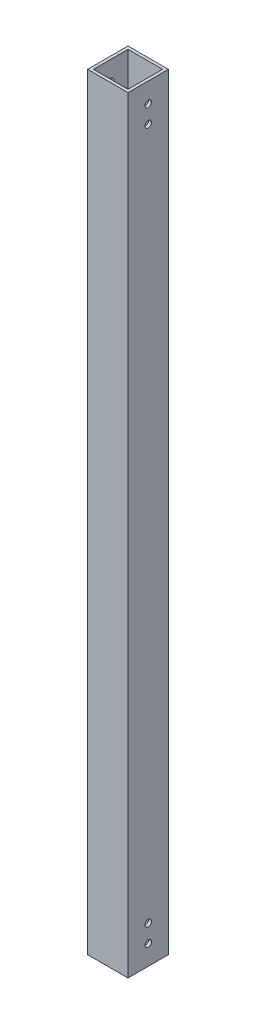
ISO-10303-21;
HEADER;
FILE_DESCRIPTION(('STEP AP214'),'2;1');
FILE_NAME('part.step','',(''),(''),'','','');
FILE_SCHEMA(('AUTOMOTIVE_DESIGN { 1 0 10303 214 1 1 1 1 }'));
ENDSEC;
DATA;
#1=APPLICATION_CONTEXT('core data for automotive mechanical design processes');
#2=APPLICATION_PROTOCOL_DEFINITION('international standard','automotive_design',2000,#1);
#3=PRODUCT_CONTEXT('',#1,'mechanical');
#4=PRODUCT('Part','Part','',(#3));
#5=PRODUCT_RELATED_PRODUCT_CATEGORY('part','',(#4));
#6=PRODUCT_DEFINITION_FORMATION('','',#4);
#7=PRODUCT_DEFINITION_CONTEXT('part definition',#1,'design');
#8=PRODUCT_DEFINITION('design','',#6,#7);
#9=PRODUCT_DEFINITION_SHAPE('','',#8);
#10=(LENGTH_UNIT() NAMED_UNIT(*) SI_UNIT(.MILLI.,.METRE.));
#11=(NAMED_UNIT(*) PLANE_ANGLE_UNIT() SI_UNIT($,.RADIAN.));
#12=(NAMED_UNIT(*) SI_UNIT($,.STERADIAN.) SOLID_ANGLE_UNIT());
#13=UNCERTAINTY_MEASURE_WITH_UNIT(LENGTH_MEASURE(1.E-05),#10,'distance_accuracy_value','');
#14=(GEOMETRIC_REPRESENTATION_CONTEXT(3) GLOBAL_UNCERTAINTY_ASSIGNED_CONTEXT((#13)) GLOBAL_UNIT_ASSIGNED_CONTEXT((#10,
#11,#12)) REPRESENTATION_CONTEXT('',''));
#15=CARTESIAN_POINT('',(0.,0.,0.));
#16=DIRECTION('',(0.,0.,1.));
#17=DIRECTION('',(1.,0.,0.));
#18=AXIS2_PLACEMENT_3D('',#15,#16,#17);
#19=CARTESIAN_POINT('',(-22.225,844.55,22.225));
#20=DIRECTION('',(1.,0.,0.));
#21=DIRECTION('',(0.,0.,-1.));
#22=AXIS2_PLACEMENT_3D('',#19,#20,#21);
#23=PLANE('',#22);
#24=CARTESIAN_POINT('',(-22.225,803.275,0.));
#25=DIRECTION('',(-1.,0.,0.));
#26=DIRECTION('',(0.,0.,1.));
#27=AXIS2_PLACEMENT_3D('',#24,#25,#26);
#28=CIRCLE('',#27,3.57123999999998);
#29=CARTESIAN_POINT('',(-22.225,803.275,3.57123999999997));
#30=VERTEX_POINT('',#29);
#31=EDGE_CURVE('E207',#30,#30,#28,.T.);
#32=ORIENTED_EDGE('',*,*,#31,.F.);
#33=EDGE_LOOP('',(#32));
#34=FACE_BOUND('',#33,.T.);
#35=CARTESIAN_POINT('',(-22.225,41.2749999999999,0.));
#36=DIRECTION('',(-1.,0.,0.));
#37=DIRECTION('',(0.,0.,1.));
#38=AXIS2_PLACEMENT_3D('',#35,#36,#37);
#39=CIRCLE('',#38,3.57123999999999);
#40=CARTESIAN_POINT('',(-22.225,41.2749999999999,3.57123999999999));
#41=VERTEX_POINT('',#40);
#42=EDGE_CURVE('E195',#41,#41,#39,.T.);
#43=ORIENTED_EDGE('',*,*,#42,.F.);
#44=EDGE_LOOP('',(#43));
#45=FACE_BOUND('',#44,.T.);
#46=CARTESIAN_POINT('',(-22.225,822.721875,0.));
#47=DIRECTION('',(-1.,0.,0.));
#48=DIRECTION('',(0.,0.,1.));
#49=AXIS2_PLACEMENT_3D('',#46,#47,#48);
#50=CIRCLE('',#49,3.57123999999998);
#51=CARTESIAN_POINT('',(-22.225,822.721875,3.57123999999998));
#52=VERTEX_POINT('',#51);
#53=EDGE_CURVE('E186',#52,#52,#50,.T.);
#54=ORIENTED_EDGE('',*,*,#53,.F.);
#55=EDGE_LOOP('',(#54));
#56=FACE_BOUND('',#55,.T.);
#57=DIRECTION('',(0.,0.,1.));
#58=VECTOR('',#57,1.);
#59=CARTESIAN_POINT('',(-22.225,0.,22.225));
#60=LINE('',#59,#58);
#61=CARTESIAN_POINT('',(-22.225,0.,-22.225));
#62=VERTEX_POINT('',#61);
#63=CARTESIAN_POINT('',(-22.225,0.,22.225));
#64=VERTEX_POINT('',#63);
#65=EDGE_CURVE('E154',#62,#64,#60,.T.);
#66=ORIENTED_EDGE('',*,*,#65,.T.);
#67=DIRECTION('',(0.,-1.,0.));
#68=VECTOR('',#67,1.);
#69=CARTESIAN_POINT('',(-22.225,844.55,22.225));
#70=LINE('',#69,#68);
#71=CARTESIAN_POINT('',(-22.225,844.55,22.225));
#72=VERTEX_POINT('',#71);
#73=EDGE_CURVE('E159',#72,#64,#70,.T.);
#74=ORIENTED_EDGE('',*,*,#73,.F.);
#75=DIRECTION('',(0.,0.,1.));
#76=VECTOR('',#75,1.);
#77=CARTESIAN_POINT('',(-22.225,844.55,22.225));
#78=LINE('',#77,#76);
#79=CARTESIAN_POINT('',(-22.225,844.55,-22.225));
#80=VERTEX_POINT('',#79);
#81=EDGE_CURVE('E145',#80,#72,#78,.T.);
#82=ORIENTED_EDGE('',*,*,#81,.F.);
#83=DIRECTION('',(0.,-1.,0.));
#84=VECTOR('',#83,1.);
#85=CARTESIAN_POINT('',(-22.225,844.55,-22.225));
#86=LINE('',#85,#84);
#87=EDGE_CURVE('E42',#80,#62,#86,.T.);
#88=ORIENTED_EDGE('',*,*,#87,.T.);
#89=EDGE_LOOP('',(#66,#74,#82,#88));
#90=FACE_BOUND('',#89,.T.);
#91=CARTESIAN_POINT('',(-22.225,21.828125,0.));
#92=DIRECTION('',(-1.,0.,0.));
#93=DIRECTION('',(0.,0.,1.));
#94=AXIS2_PLACEMENT_3D('',#91,#92,#93);
#95=CIRCLE('',#94,3.57123999999999);
#96=CARTESIAN_POINT('',(-22.225,21.828125,3.57123999999999));
#97=VERTEX_POINT('',#96);
#98=EDGE_CURVE('E170',#97,#97,#95,.T.);
#99=ORIENTED_EDGE('',*,*,#98,.F.);
#100=EDGE_LOOP('',(#99));
#101=FACE_BOUND('',#100,.T.);
#102=ADVANCED_FACE('F33',(#34,#45,#56,#90,#101),#23,.F.);
#103=CARTESIAN_POINT('',(0.,844.55,0.));
#104=DIRECTION('',(0.,-1.,0.));
#105=DIRECTION('',(0.,0.,-1.));
#106=AXIS2_PLACEMENT_3D('',#103,#104,#105);
#107=PLANE('',#106);
#108=DIRECTION('',(0.,0.,-1.));
#109=VECTOR('',#108,1.);
#110=CARTESIAN_POINT('',(22.225,844.55,22.225));
#111=LINE('',#110,#109);
#112=CARTESIAN_POINT('',(22.225,844.55,22.225));
#113=VERTEX_POINT('',#112);
#114=CARTESIAN_POINT('',(22.225,844.55,-22.225));
#115=VERTEX_POINT('',#114);
#116=EDGE_CURVE('E139',#113,#115,#111,.T.);
#117=ORIENTED_EDGE('',*,*,#116,.T.);
#118=DIRECTION('',(-1.,0.,0.));
#119=VECTOR('',#118,1.);
#120=CARTESIAN_POINT('',(-22.225,844.55,-22.225));
#121=LINE('',#120,#119);
#122=EDGE_CURVE('E142',#115,#80,#121,.T.);
#123=ORIENTED_EDGE('',*,*,#122,.T.);
#124=ORIENTED_EDGE('',*,*,#81,.T.);
#125=DIRECTION('',(1.,0.,0.));
#126=VECTOR('',#125,1.);
#127=CARTESIAN_POINT('',(-22.225,844.55,22.225));
#128=LINE('',#127,#126);
#129=EDGE_CURVE('E147',#72,#113,#128,.T.);
#130=ORIENTED_EDGE('',*,*,#129,.T.);
#131=EDGE_LOOP('',(#117,#123,#124,#130));
#132=FACE_BOUND('',#131,.T.);
#133=DIRECTION('',(1.,0.,0.));
#134=VECTOR('',#133,1.);
#135=CARTESIAN_POINT('',(-19.05,844.55,19.05));
#136=LINE('',#135,#134);
#137=CARTESIAN_POINT('',(-19.05,844.55,19.05));
#138=VERTEX_POINT('',#137);
#139=CARTESIAN_POINT('',(19.05,844.55,19.05));
#140=VERTEX_POINT('',#139);
#141=EDGE_CURVE('E100',#138,#140,#136,.T.);
#142=ORIENTED_EDGE('',*,*,#141,.F.);
#143=DIRECTION('',(0.,0.,1.));
#144=VECTOR('',#143,1.);
#145=CARTESIAN_POINT('',(-19.05,844.55,19.05));
#146=LINE('',#145,#144);
#147=CARTESIAN_POINT('',(-19.05,844.55,-19.05));
#148=VERTEX_POINT('',#147);
#149=EDGE_CURVE('E123',#148,#138,#146,.T.);
#150=ORIENTED_EDGE('',*,*,#149,.F.);
#151=DIRECTION('',(-1.,0.,0.));
#152=VECTOR('',#151,1.);
#153=CARTESIAN_POINT('',(-19.05,844.55,-19.05));
#154=LINE('',#153,#152);
#155=CARTESIAN_POINT('',(19.05,844.55,-19.05));
#156=VERTEX_POINT('',#155);
#157=EDGE_CURVE('E121',#156,#148,#154,.T.);
#158=ORIENTED_EDGE('',*,*,#157,.F.);
#159=DIRECTION('',(0.,0.,-1.));
#160=VECTOR('',#159,1.);
#161=CARTESIAN_POINT('',(19.05,844.55,19.05));
#162=LINE('',#161,#160);
#163=EDGE_CURVE('E108',#140,#156,#162,.T.);
#164=ORIENTED_EDGE('',*,*,#163,.F.);
#165=EDGE_LOOP('',(#142,#150,#158,#164));
#166=FACE_BOUND('',#165,.T.);
#167=ADVANCED_FACE('F120',(#132,#166),#107,.F.);
#168=CARTESIAN_POINT('',(0.,0.,0.));
#169=DIRECTION('',(0.,-1.,0.));
#170=DIRECTION('',(0.,0.,-1.));
#171=AXIS2_PLACEMENT_3D('',#168,#169,#170);
#172=PLANE('',#171);
#173=DIRECTION('',(0.,0.,-1.));
#174=VECTOR('',#173,1.);
#175=CARTESIAN_POINT('',(22.225,0.,22.225));
#176=LINE('',#175,#174);
#177=CARTESIAN_POINT('',(22.225,0.,22.225));
#178=VERTEX_POINT('',#177);
#179=CARTESIAN_POINT('',(22.225,0.,-22.225));
#180=VERTEX_POINT('',#179);
#181=EDGE_CURVE('E116',#178,#180,#176,.T.);
#182=ORIENTED_EDGE('',*,*,#181,.F.);
#183=DIRECTION('',(1.,0.,0.));
#184=VECTOR('',#183,1.);
#185=CARTESIAN_POINT('',(-22.225,0.,22.225));
#186=LINE('',#185,#184);
#187=EDGE_CURVE('E143',#64,#178,#186,.T.);
#188=ORIENTED_EDGE('',*,*,#187,.F.);
#189=ORIENTED_EDGE('',*,*,#65,.F.);
#190=DIRECTION('',(-1.,0.,0.));
#191=VECTOR('',#190,1.);
#192=CARTESIAN_POINT('',(-22.225,0.,-22.225));
#193=LINE('',#192,#191);
#194=EDGE_CURVE('E152',#180,#62,#193,.T.);
#195=ORIENTED_EDGE('',*,*,#194,.F.);
#196=EDGE_LOOP('',(#182,#188,#189,#195));
#197=FACE_BOUND('',#196,.T.);
#198=DIRECTION('',(0.,0.,1.));
#199=VECTOR('',#198,1.);
#200=CARTESIAN_POINT('',(-19.05,0.,19.05));
#201=LINE('',#200,#199);
#202=CARTESIAN_POINT('',(-19.05,0.,-19.05));
#203=VERTEX_POINT('',#202);
#204=CARTESIAN_POINT('',(-19.05,0.,19.05));
#205=VERTEX_POINT('',#204);
#206=EDGE_CURVE('E109',#203,#205,#201,.T.);
#207=ORIENTED_EDGE('',*,*,#206,.T.);
#208=DIRECTION('',(1.,0.,0.));
#209=VECTOR('',#208,1.);
#210=CARTESIAN_POINT('',(-19.05,0.,19.05));
#211=LINE('',#210,#209);
#212=CARTESIAN_POINT('',(19.05,0.,19.05));
#213=VERTEX_POINT('',#212);
#214=EDGE_CURVE('E58',#205,#213,#211,.T.);
#215=ORIENTED_EDGE('',*,*,#214,.T.);
#216=DIRECTION('',(0.,0.,-1.));
#217=VECTOR('',#216,1.);
#218=CARTESIAN_POINT('',(19.05,0.,19.05));
#219=LINE('',#218,#217);
#220=CARTESIAN_POINT('',(19.05,0.,-19.05));
#221=VERTEX_POINT('',#220);
#222=EDGE_CURVE('E115',#213,#221,#219,.T.);
#223=ORIENTED_EDGE('',*,*,#222,.T.);
#224=DIRECTION('',(-1.,0.,0.));
#225=VECTOR('',#224,1.);
#226=CARTESIAN_POINT('',(-19.05,0.,-19.05));
#227=LINE('',#226,#225);
#228=EDGE_CURVE('E131',#221,#203,#227,.T.);
#229=ORIENTED_EDGE('',*,*,#228,.T.);
#230=EDGE_LOOP('',(#207,#215,#223,#229));
#231=FACE_BOUND('',#230,.T.);
#232=ADVANCED_FACE('F256',(#197,#231),#172,.T.);
#233=CARTESIAN_POINT('',(22.225,844.55,22.225));
#234=DIRECTION('',(-1.,0.,0.));
#235=DIRECTION('',(0.,0.,1.));
#236=AXIS2_PLACEMENT_3D('',#233,#234,#235);
#237=PLANE('',#236);
#238=CARTESIAN_POINT('',(22.225,803.275,0.));
#239=DIRECTION('',(-1.,0.,0.));
#240=DIRECTION('',(0.,0.,1.));
#241=AXIS2_PLACEMENT_3D('',#238,#239,#240);
#242=CIRCLE('',#241,3.57123999999998);
#243=CARTESIAN_POINT('',(22.225,803.275,3.57123999999997));
#244=VERTEX_POINT('',#243);
#245=EDGE_CURVE('E204',#244,#244,#242,.T.);
#246=ORIENTED_EDGE('',*,*,#245,.T.);
#247=EDGE_LOOP('',(#246));
#248=FACE_BOUND('',#247,.T.);
#249=CARTESIAN_POINT('',(22.225,41.2749999999999,0.));
#250=DIRECTION('',(-1.,0.,0.));
#251=DIRECTION('',(0.,0.,1.));
#252=AXIS2_PLACEMENT_3D('',#249,#250,#251);
#253=CIRCLE('',#252,3.57123999999999);
#254=CARTESIAN_POINT('',(22.225,41.2749999999999,3.57123999999999));
#255=VERTEX_POINT('',#254);
#256=EDGE_CURVE('E192',#255,#255,#253,.T.);
#257=ORIENTED_EDGE('',*,*,#256,.T.);
#258=EDGE_LOOP('',(#257));
#259=FACE_BOUND('',#258,.T.);
#260=CARTESIAN_POINT('',(22.225,822.721875,0.));
#261=DIRECTION('',(-1.,0.,0.));
#262=DIRECTION('',(0.,0.,1.));
#263=AXIS2_PLACEMENT_3D('',#260,#261,#262);
#264=CIRCLE('',#263,3.57123999999998);
#265=CARTESIAN_POINT('',(22.225,822.721875,3.57123999999998));
#266=VERTEX_POINT('',#265);
#267=EDGE_CURVE('E183',#266,#266,#264,.T.);
#268=ORIENTED_EDGE('',*,*,#267,.T.);
#269=EDGE_LOOP('',(#268));
#270=FACE_BOUND('',#269,.T.);
#271=CARTESIAN_POINT('',(22.225,21.828125,0.));
#272=DIRECTION('',(-1.,0.,0.));
#273=DIRECTION('',(0.,0.,1.));
#274=AXIS2_PLACEMENT_3D('',#271,#272,#273);
#275=CIRCLE('',#274,3.57123999999999);
#276=CARTESIAN_POINT('',(22.225,21.828125,3.57123999999999));
#277=VERTEX_POINT('',#276);
#278=EDGE_CURVE('E165',#277,#277,#275,.T.);
#279=ORIENTED_EDGE('',*,*,#278,.T.);
#280=EDGE_LOOP('',(#279));
#281=FACE_BOUND('',#280,.T.);
#282=ORIENTED_EDGE('',*,*,#181,.T.);
#283=DIRECTION('',(0.,-1.,0.));
#284=VECTOR('',#283,1.);
#285=CARTESIAN_POINT('',(22.225,844.55,-22.225));
#286=LINE('',#285,#284);
#287=EDGE_CURVE('E11',#115,#180,#286,.T.);
#288=ORIENTED_EDGE('',*,*,#287,.F.);
#289=ORIENTED_EDGE('',*,*,#116,.F.);
#290=DIRECTION('',(0.,-1.,0.));
#291=VECTOR('',#290,1.);
#292=CARTESIAN_POINT('',(22.225,844.55,22.225));
#293=LINE('',#292,#291);
#294=EDGE_CURVE('E149',#113,#178,#293,.T.);
#295=ORIENTED_EDGE('',*,*,#294,.T.);
#296=EDGE_LOOP('',(#282,#288,#289,#295));
#297=FACE_BOUND('',#296,.T.);
#298=ADVANCED_FACE('F35',(#248,#259,#270,#281,#297),#237,.F.);
#299=CARTESIAN_POINT('',(-22.225,844.55,-22.225));
#300=DIRECTION('',(0.,0.,1.));
#301=DIRECTION('',(1.,0.,0.));
#302=AXIS2_PLACEMENT_3D('',#299,#300,#301);
#303=PLANE('',#302);
#304=ORIENTED_EDGE('',*,*,#194,.T.);
#305=ORIENTED_EDGE('',*,*,#87,.F.);
#306=ORIENTED_EDGE('',*,*,#122,.F.);
#307=ORIENTED_EDGE('',*,*,#287,.T.);
#308=EDGE_LOOP('',(#304,#305,#306,#307));
#309=FACE_BOUND('',#308,.T.);
#310=ADVANCED_FACE('F262',(#309),#303,.F.);
#311=CARTESIAN_POINT('',(-22.225,844.55,22.225));
#312=DIRECTION('',(0.,0.,-1.));
#313=DIRECTION('',(-1.,0.,0.));
#314=AXIS2_PLACEMENT_3D('',#311,#312,#313);
#315=PLANE('',#314);
#316=ORIENTED_EDGE('',*,*,#187,.T.);
#317=ORIENTED_EDGE('',*,*,#294,.F.);
#318=ORIENTED_EDGE('',*,*,#129,.F.);
#319=ORIENTED_EDGE('',*,*,#73,.T.);
#320=EDGE_LOOP('',(#316,#317,#318,#319));
#321=FACE_BOUND('',#320,.T.);
#322=ADVANCED_FACE('F253',(#321),#315,.F.);
#323=CARTESIAN_POINT('',(-19.05,844.55,19.05));
#324=DIRECTION('',(0.,0.,-1.));
#325=DIRECTION('',(-1.,0.,0.));
#326=AXIS2_PLACEMENT_3D('',#323,#324,#325);
#327=PLANE('',#326);
#328=ORIENTED_EDGE('',*,*,#214,.F.);
#329=DIRECTION('',(0.,-1.,0.));
#330=VECTOR('',#329,1.);
#331=CARTESIAN_POINT('',(-19.05,844.55,19.05));
#332=LINE('',#331,#330);
#333=EDGE_CURVE('E104',#138,#205,#332,.T.);
#334=ORIENTED_EDGE('',*,*,#333,.F.);
#335=ORIENTED_EDGE('',*,*,#141,.T.);
#336=DIRECTION('',(0.,-1.,0.));
#337=VECTOR('',#336,1.);
#338=CARTESIAN_POINT('',(19.05,844.55,19.05));
#339=LINE('',#338,#337);
#340=EDGE_CURVE('E103',#140,#213,#339,.T.);
#341=ORIENTED_EDGE('',*,*,#340,.T.);
#342=EDGE_LOOP('',(#328,#334,#335,#341));
#343=FACE_BOUND('',#342,.T.);
#344=ADVANCED_FACE('F102',(#343),#327,.T.);
#345=CARTESIAN_POINT('',(19.05,844.55,19.05));
#346=DIRECTION('',(-1.,0.,0.));
#347=DIRECTION('',(0.,0.,1.));
#348=AXIS2_PLACEMENT_3D('',#345,#346,#347);
#349=PLANE('',#348);
#350=CARTESIAN_POINT('',(19.05,803.275,0.));
#351=DIRECTION('',(-1.,0.,0.));
#352=DIRECTION('',(0.,0.,1.));
#353=AXIS2_PLACEMENT_3D('',#350,#351,#352);
#354=CIRCLE('',#353,3.57123999999998);
#355=CARTESIAN_POINT('',(19.05,803.275,3.57123999999997));
#356=VERTEX_POINT('',#355);
#357=EDGE_CURVE('E198',#356,#356,#354,.T.);
#358=ORIENTED_EDGE('',*,*,#357,.F.);
#359=EDGE_LOOP('',(#358));
#360=FACE_BOUND('',#359,.T.);
#361=CARTESIAN_POINT('',(19.05,41.2749999999999,0.));
#362=DIRECTION('',(-1.,0.,0.));
#363=DIRECTION('',(0.,0.,1.));
#364=AXIS2_PLACEMENT_3D('',#361,#362,#363);
#365=CIRCLE('',#364,3.57123999999999);
#366=CARTESIAN_POINT('',(19.05,41.2749999999999,3.57123999999999));
#367=VERTEX_POINT('',#366);
#368=EDGE_CURVE('E189',#367,#367,#365,.T.);
#369=ORIENTED_EDGE('',*,*,#368,.F.);
#370=EDGE_LOOP('',(#369));
#371=FACE_BOUND('',#370,.T.);
#372=CARTESIAN_POINT('',(19.05,822.721875,0.));
#373=DIRECTION('',(-1.,0.,0.));
#374=DIRECTION('',(0.,0.,1.));
#375=AXIS2_PLACEMENT_3D('',#372,#373,#374);
#376=CIRCLE('',#375,3.57123999999998);
#377=CARTESIAN_POINT('',(19.05,822.721875,3.57123999999998));
#378=VERTEX_POINT('',#377);
#379=EDGE_CURVE('E175',#378,#378,#376,.T.);
#380=ORIENTED_EDGE('',*,*,#379,.F.);
#381=EDGE_LOOP('',(#380));
#382=FACE_BOUND('',#381,.T.);
#383=CARTESIAN_POINT('',(19.05,21.828125,0.));
#384=DIRECTION('',(-1.,0.,0.));
#385=DIRECTION('',(0.,0.,1.));
#386=AXIS2_PLACEMENT_3D('',#383,#384,#385);
#387=CIRCLE('',#386,3.57123999999999);
#388=CARTESIAN_POINT('',(19.05,21.828125,3.57123999999999));
#389=VERTEX_POINT('',#388);
#390=EDGE_CURVE('E163',#389,#389,#387,.T.);
#391=ORIENTED_EDGE('',*,*,#390,.F.);
#392=EDGE_LOOP('',(#391));
#393=FACE_BOUND('',#392,.T.);
#394=ORIENTED_EDGE('',*,*,#222,.F.);
#395=ORIENTED_EDGE('',*,*,#340,.F.);
#396=ORIENTED_EDGE('',*,*,#163,.T.);
#397=DIRECTION('',(0.,-1.,0.));
#398=VECTOR('',#397,1.);
#399=CARTESIAN_POINT('',(19.05,844.55,-19.05));
#400=LINE('',#399,#398);
#401=EDGE_CURVE('E117',#156,#221,#400,.T.);
#402=ORIENTED_EDGE('',*,*,#401,.T.);
#403=EDGE_LOOP('',(#394,#395,#396,#402));
#404=FACE_BOUND('',#403,.T.);
#405=ADVANCED_FACE('F112',(#360,#371,#382,#393,#404),#349,.T.);
#406=CARTESIAN_POINT('',(-19.05,844.55,-19.05));
#407=DIRECTION('',(0.,0.,1.));
#408=DIRECTION('',(1.,0.,0.));
#409=AXIS2_PLACEMENT_3D('',#406,#407,#408);
#410=PLANE('',#409);
#411=ORIENTED_EDGE('',*,*,#228,.F.);
#412=ORIENTED_EDGE('',*,*,#401,.F.);
#413=ORIENTED_EDGE('',*,*,#157,.T.);
#414=DIRECTION('',(0.,-1.,0.));
#415=VECTOR('',#414,1.);
#416=CARTESIAN_POINT('',(-19.05,844.55,-19.05));
#417=LINE('',#416,#415);
#418=EDGE_CURVE('E50',#148,#203,#417,.T.);
#419=ORIENTED_EDGE('',*,*,#418,.T.);
#420=EDGE_LOOP('',(#411,#412,#413,#419));
#421=FACE_BOUND('',#420,.T.);
#422=ADVANCED_FACE('F243',(#421),#410,.T.);
#423=CARTESIAN_POINT('',(-19.05,844.55,19.05));
#424=DIRECTION('',(1.,0.,0.));
#425=DIRECTION('',(0.,0.,-1.));
#426=AXIS2_PLACEMENT_3D('',#423,#424,#425);
#427=PLANE('',#426);
#428=CARTESIAN_POINT('',(-19.05,803.275,0.));
#429=DIRECTION('',(1.,0.,0.));
#430=DIRECTION('',(0.,0.,-1.));
#431=AXIS2_PLACEMENT_3D('',#428,#429,#430);
#432=CIRCLE('',#431,3.57123999999998);
#433=CARTESIAN_POINT('',(-19.05,803.275,-3.57123999999998));
#434=VERTEX_POINT('',#433);
#435=EDGE_CURVE('E201',#434,#434,#432,.T.);
#436=ORIENTED_EDGE('',*,*,#435,.F.);
#437=EDGE_LOOP('',(#436));
#438=FACE_BOUND('',#437,.T.);
#439=CARTESIAN_POINT('',(-19.05,41.2749999999999,0.));
#440=DIRECTION('',(1.,0.,0.));
#441=DIRECTION('',(0.,0.,-1.));
#442=AXIS2_PLACEMENT_3D('',#439,#440,#441);
#443=CIRCLE('',#442,3.57123999999999);
#444=CARTESIAN_POINT('',(-19.05,41.2749999999999,-3.57123999999999));
#445=VERTEX_POINT('',#444);
#446=EDGE_CURVE('E37',#445,#445,#443,.T.);
#447=ORIENTED_EDGE('',*,*,#446,.F.);
#448=EDGE_LOOP('',(#447));
#449=FACE_BOUND('',#448,.T.);
#450=CARTESIAN_POINT('',(-19.05,822.721875,0.));
#451=DIRECTION('',(1.,0.,0.));
#452=DIRECTION('',(0.,0.,-1.));
#453=AXIS2_PLACEMENT_3D('',#450,#451,#452);
#454=CIRCLE('',#453,3.57123999999998);
#455=CARTESIAN_POINT('',(-19.05,822.721875,-3.57123999999997));
#456=VERTEX_POINT('',#455);
#457=EDGE_CURVE('E180',#456,#456,#454,.T.);
#458=ORIENTED_EDGE('',*,*,#457,.F.);
#459=EDGE_LOOP('',(#458));
#460=FACE_BOUND('',#459,.T.);
#461=CARTESIAN_POINT('',(-19.05,21.828125,0.));
#462=DIRECTION('',(1.,0.,0.));
#463=DIRECTION('',(0.,0.,-1.));
#464=AXIS2_PLACEMENT_3D('',#461,#462,#463);
#465=CIRCLE('',#464,3.57123999999999);
#466=CARTESIAN_POINT('',(-19.05,21.828125,-3.57123999999999));
#467=VERTEX_POINT('',#466);
#468=EDGE_CURVE('E129',#467,#467,#465,.T.);
#469=ORIENTED_EDGE('',*,*,#468,.F.);
#470=EDGE_LOOP('',(#469));
#471=FACE_BOUND('',#470,.T.);
#472=ORIENTED_EDGE('',*,*,#206,.F.);
#473=ORIENTED_EDGE('',*,*,#418,.F.);
#474=ORIENTED_EDGE('',*,*,#149,.T.);
#475=ORIENTED_EDGE('',*,*,#333,.T.);
#476=EDGE_LOOP('',(#472,#473,#474,#475));
#477=FACE_BOUND('',#476,.T.);
#478=ADVANCED_FACE('F238',(#438,#449,#460,#471,#477),#427,.T.);
#479=CARTESIAN_POINT('',(-22.225,21.828125,0.));
#480=DIRECTION('',(-1.,0.,0.));
#481=DIRECTION('',(0.,0.,1.));
#482=AXIS2_PLACEMENT_3D('',#479,#480,#481);
#483=CYLINDRICAL_SURFACE('',#482,3.57123999999999);
#484=ORIENTED_EDGE('',*,*,#390,.T.);
#485=EDGE_LOOP('',(#484));
#486=FACE_BOUND('',#485,.T.);
#487=ORIENTED_EDGE('',*,*,#278,.F.);
#488=EDGE_LOOP('',(#487));
#489=FACE_BOUND('',#488,.T.);
#490=ADVANCED_FACE('F228',(#486,#489),#483,.F.);
#491=ORIENTED_EDGE('',*,*,#468,.T.);
#492=EDGE_LOOP('',(#491));
#493=FACE_BOUND('',#492,.T.);
#494=ORIENTED_EDGE('',*,*,#98,.T.);
#495=EDGE_LOOP('',(#494));
#496=FACE_BOUND('',#495,.T.);
#497=ADVANCED_FACE('F225',(#493,#496),#483,.F.);
#498=CARTESIAN_POINT('',(-22.225,822.721875,0.));
#499=DIRECTION('',(-1.,0.,0.));
#500=DIRECTION('',(0.,0.,1.));
#501=AXIS2_PLACEMENT_3D('',#498,#499,#500);
#502=CYLINDRICAL_SURFACE('',#501,3.57123999999998);
#503=ORIENTED_EDGE('',*,*,#379,.T.);
#504=EDGE_LOOP('',(#503));
#505=FACE_BOUND('',#504,.T.);
#506=ORIENTED_EDGE('',*,*,#267,.F.);
#507=EDGE_LOOP('',(#506));
#508=FACE_BOUND('',#507,.T.);
#509=ADVANCED_FACE('F227',(#505,#508),#502,.F.);
#510=ORIENTED_EDGE('',*,*,#457,.T.);
#511=EDGE_LOOP('',(#510));
#512=FACE_BOUND('',#511,.T.);
#513=ORIENTED_EDGE('',*,*,#53,.T.);
#514=EDGE_LOOP('',(#513));
#515=FACE_BOUND('',#514,.T.);
#516=ADVANCED_FACE('F235',(#512,#515),#502,.F.);
#517=CARTESIAN_POINT('',(-22.225,41.2749999999999,0.));
#518=DIRECTION('',(-1.,0.,0.));
#519=DIRECTION('',(0.,0.,1.));
#520=AXIS2_PLACEMENT_3D('',#517,#518,#519);
#521=CYLINDRICAL_SURFACE('',#520,3.57123999999999);
#522=ORIENTED_EDGE('',*,*,#446,.T.);
#523=EDGE_LOOP('',(#522));
#524=FACE_BOUND('',#523,.T.);
#525=ORIENTED_EDGE('',*,*,#42,.T.);
#526=EDGE_LOOP('',(#525));
#527=FACE_BOUND('',#526,.T.);
#528=ADVANCED_FACE('F292',(#524,#527),#521,.F.);
#529=ORIENTED_EDGE('',*,*,#368,.T.);
#530=EDGE_LOOP('',(#529));
#531=FACE_BOUND('',#530,.T.);
#532=ORIENTED_EDGE('',*,*,#256,.F.);
#533=EDGE_LOOP('',(#532));
#534=FACE_BOUND('',#533,.T.);
#535=ADVANCED_FACE('F290',(#531,#534),#521,.F.);
#536=CARTESIAN_POINT('',(-22.225,803.275,0.));
#537=DIRECTION('',(-1.,0.,0.));
#538=DIRECTION('',(0.,0.,1.));
#539=AXIS2_PLACEMENT_3D('',#536,#537,#538);
#540=CYLINDRICAL_SURFACE('',#539,3.57123999999998);
#541=ORIENTED_EDGE('',*,*,#435,.T.);
#542=EDGE_LOOP('',(#541));
#543=FACE_BOUND('',#542,.T.);
#544=ORIENTED_EDGE('',*,*,#31,.T.);
#545=EDGE_LOOP('',(#544));
#546=FACE_BOUND('',#545,.T.);
#547=ADVANCED_FACE('F211',(#543,#546),#540,.F.);
#548=ORIENTED_EDGE('',*,*,#357,.T.);
#549=EDGE_LOOP('',(#548));
#550=FACE_BOUND('',#549,.T.);
#551=ORIENTED_EDGE('',*,*,#245,.F.);
#552=EDGE_LOOP('',(#551));
#553=FACE_BOUND('',#552,.T.);
#554=ADVANCED_FACE('F298',(#550,#553),#540,.F.);
#555=CLOSED_SHELL('',(#102,#167,#232,#298,#310,#322,#344,#405,#422,#478,#490,#497,#509,#516,
#528,#535,#547,#554));
#556=MANIFOLD_SOLID_BREP('B2',#555);
#557=ADVANCED_BREP_SHAPE_REPRESENTATION('',(#18,#556),#14);
#558=SHAPE_DEFINITION_REPRESENTATION(#9,#557);
ENDSEC;
END-ISO-10303-21;
